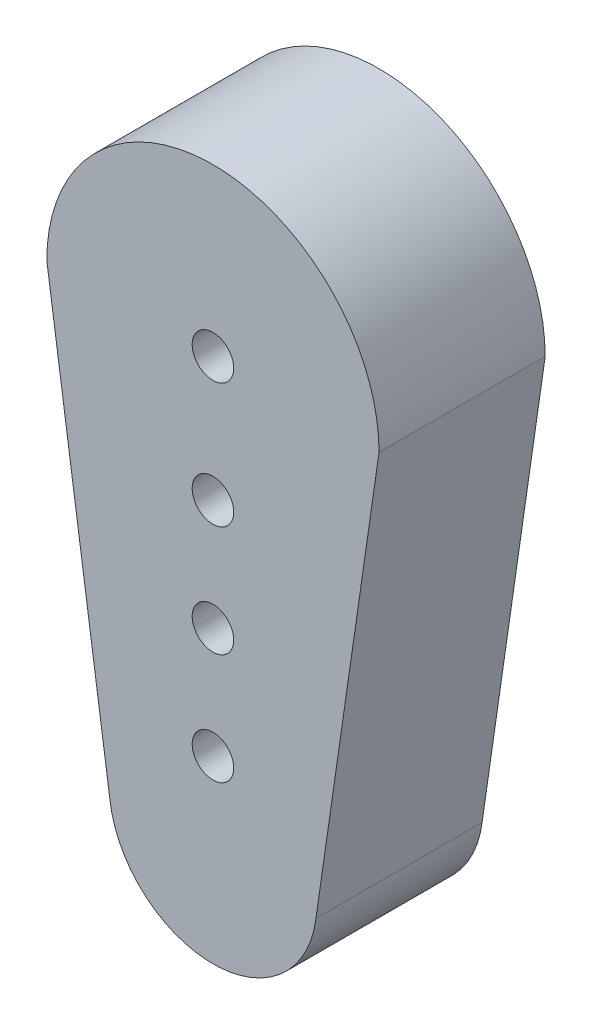
ISO-10303-21;
HEADER;
FILE_DESCRIPTION(('STEP AP214'),'2;1');
FILE_NAME('part.step','',(''),(''),'','','');
FILE_SCHEMA(('AUTOMOTIVE_DESIGN { 1 0 10303 214 1 1 1 1 }'));
ENDSEC;
DATA;
#1=APPLICATION_CONTEXT('core data for automotive mechanical design processes');
#2=APPLICATION_PROTOCOL_DEFINITION('international standard','automotive_design',2000,#1);
#3=PRODUCT_CONTEXT('',#1,'mechanical');
#4=PRODUCT('Part','Part','',(#3));
#5=PRODUCT_RELATED_PRODUCT_CATEGORY('part','',(#4));
#6=PRODUCT_DEFINITION_FORMATION('','',#4);
#7=PRODUCT_DEFINITION_CONTEXT('part definition',#1,'design');
#8=PRODUCT_DEFINITION('design','',#6,#7);
#9=PRODUCT_DEFINITION_SHAPE('','',#8);
#10=(LENGTH_UNIT() NAMED_UNIT(*) SI_UNIT(.MILLI.,.METRE.));
#11=(NAMED_UNIT(*) PLANE_ANGLE_UNIT() SI_UNIT($,.RADIAN.));
#12=(NAMED_UNIT(*) SI_UNIT($,.STERADIAN.) SOLID_ANGLE_UNIT());
#13=UNCERTAINTY_MEASURE_WITH_UNIT(LENGTH_MEASURE(1.E-05),#10,'distance_accuracy_value','');
#14=(GEOMETRIC_REPRESENTATION_CONTEXT(3) GLOBAL_UNCERTAINTY_ASSIGNED_CONTEXT((#13)) GLOBAL_UNIT_ASSIGNED_CONTEXT((#10,
#11,#12)) REPRESENTATION_CONTEXT('',''));
#15=CARTESIAN_POINT('',(0.,0.,0.));
#16=DIRECTION('',(0.,0.,1.));
#17=DIRECTION('',(1.,0.,0.));
#18=AXIS2_PLACEMENT_3D('',#15,#16,#17);
#19=CARTESIAN_POINT('',(-1.19664990586423E-09,-12.6420487647722,6.05130844555376));
#20=DIRECTION('',(0.,0.,-1.));
#21=DIRECTION('',(-1.,0.,0.));
#22=AXIS2_PLACEMENT_3D('',#19,#20,#21);
#23=CYLINDRICAL_SURFACE('',#22,0.765);
#24=CARTESIAN_POINT('',(-1.19664990586423E-09,-12.6420487647722,6.05130844555376));
#25=DIRECTION('',(0.,0.,-1.));
#26=DIRECTION('',(-1.,0.,0.));
#27=AXIS2_PLACEMENT_3D('',#24,#25,#26);
#28=CIRCLE('',#27,0.765);
#29=CARTESIAN_POINT('',(-0.76500000119665,-12.6420487647722,6.05130844555376));
#30=VERTEX_POINT('',#29);
#31=EDGE_CURVE('E43',#30,#30,#28,.T.);
#32=ORIENTED_EDGE('',*,*,#31,.F.);
#33=EDGE_LOOP('',(#32));
#34=FACE_BOUND('',#33,.T.);
#35=CARTESIAN_POINT('',(-1.19664990586423E-09,-12.6420487647722,4.72530844555376));
#36=DIRECTION('',(0.,0.,1.));
#37=DIRECTION('',(1.,0.,0.));
#38=AXIS2_PLACEMENT_3D('',#35,#36,#37);
#39=CIRCLE('',#38,0.765);
#40=CARTESIAN_POINT('',(0.76499999880335,-12.6420487647722,4.72530844555376));
#41=VERTEX_POINT('',#40);
#42=EDGE_CURVE('E11',#41,#41,#39,.T.);
#43=ORIENTED_EDGE('',*,*,#42,.F.);
#44=EDGE_LOOP('',(#43));
#45=FACE_BOUND('',#44,.T.);
#46=ADVANCED_FACE('F36',(#34,#45),#23,.F.);
#47=CARTESIAN_POINT('',(-1.19664990586423E-09,0.107951235227818,-0.0686915544462373));
#48=DIRECTION('',(0.,0.,1.));
#49=DIRECTION('',(1.,0.,0.));
#50=AXIS2_PLACEMENT_3D('',#47,#48,#49);
#51=PLANE('',#50);
#52=CARTESIAN_POINT('',(-1.19664990586423E-09,0.107951235227818,-0.0686915544462373));
#53=DIRECTION('',(0.,0.,1.));
#54=DIRECTION('',(1.,0.,0.));
#55=AXIS2_PLACEMENT_3D('',#52,#53,#54);
#56=CIRCLE('',#55,6.12);
#57=CARTESIAN_POINT('',(6.11999999880335,0.107951235227818,-0.0686915544462373));
#58=VERTEX_POINT('',#57);
#59=CARTESIAN_POINT('',(-6.12000000119665,0.107951235227818,-0.0686915544462373));
#60=VERTEX_POINT('',#59);
#61=EDGE_CURVE('E131',#58,#60,#56,.T.);
#62=ORIENTED_EDGE('',*,*,#61,.F.);
#63=DIRECTION('',(0.143511087190295,0.989648709317331,0.));
#64=VECTOR('',#63,1.);
#65=CARTESIAN_POINT('',(6.11999999880335,0.107951235227818,-0.0686915544462373));
#66=LINE('',#65,#64);
#67=CARTESIAN_POINT('',(3.79498273594539,-15.9253070891053,-0.0686915544462373));
#68=VERTEX_POINT('',#67);
#69=EDGE_CURVE('E80',#68,#58,#66,.T.);
#70=ORIENTED_EDGE('',*,*,#69,.F.);
#71=CARTESIAN_POINT('',(-1.19664990586423E-09,-15.4470487647722,-0.0686915544462373));
#72=DIRECTION('',(0.,0.,1.));
#73=DIRECTION('',(1.,0.,0.));
#74=AXIS2_PLACEMENT_3D('',#71,#72,#73);
#75=CIRCLE('',#74,3.825);
#76=CARTESIAN_POINT('',(-3.79498426071311,-15.9252950088999,-0.0686915544462373));
#77=VERTEX_POINT('',#76);
#78=EDGE_CURVE('E149',#77,#68,#75,.T.);
#79=ORIENTED_EDGE('',*,*,#78,.F.);
#80=DIRECTION('',(0.143511101058466,-0.989648707306278,0.));
#81=VECTOR('',#80,1.);
#82=CARTESIAN_POINT('',(-6.12000000119665,0.107951235227818,-0.0686915544462373));
#83=LINE('',#82,#81);
#84=EDGE_CURVE('E135',#60,#77,#83,.T.);
#85=ORIENTED_EDGE('',*,*,#84,.F.);
#86=EDGE_LOOP('',(#62,#70,#79,#85));
#87=FACE_BOUND('',#86,.T.);
#88=CARTESIAN_POINT('',(-1.19664990586423E-09,0.107951235227818,-0.0686915544462373));
#89=DIRECTION('',(0.,0.,1.));
#90=DIRECTION('',(1.,0.,0.));
#91=AXIS2_PLACEMENT_3D('',#88,#89,#90);
#92=CIRCLE('',#91,3.825);
#93=CARTESIAN_POINT('',(3.82499999880335,0.107951235227818,-0.0686915544462373));
#94=VERTEX_POINT('',#93);
#95=CARTESIAN_POINT('',(-3.82500000119665,0.107951235227818,-0.0686915544462373));
#96=VERTEX_POINT('',#95);
#97=EDGE_CURVE('E50',#94,#96,#92,.T.);
#98=ORIENTED_EDGE('',*,*,#97,.T.);
#99=DIRECTION('',(0.0995037190209989,-0.995037190209989,0.));
#100=VECTOR('',#99,1.);
#101=CARTESIAN_POINT('',(-3.82500000119665,0.107951235227818,-0.0686915544462373));
#102=LINE('',#101,#100);
#103=CARTESIAN_POINT('',(-2.29500000119665,-15.1920487647722,-0.0686915544462373));
#104=VERTEX_POINT('',#103);
#105=EDGE_CURVE('E130',#96,#104,#102,.T.);
#106=ORIENTED_EDGE('',*,*,#105,.T.);
#107=CARTESIAN_POINT('',(-1.19664990586423E-09,-15.1920487647722,-0.0686915544462373));
#108=DIRECTION('',(0.,0.,1.));
#109=DIRECTION('',(1.,0.,0.));
#110=AXIS2_PLACEMENT_3D('',#107,#108,#109);
#111=CIRCLE('',#110,2.295);
#112=CARTESIAN_POINT('',(2.29499999880335,-15.1920487647722,-0.0686915544462373));
#113=VERTEX_POINT('',#112);
#114=EDGE_CURVE('E233',#104,#113,#111,.T.);
#115=ORIENTED_EDGE('',*,*,#114,.T.);
#116=DIRECTION('',(0.0995037190209989,0.995037190209989,0.));
#117=VECTOR('',#116,1.);
#118=CARTESIAN_POINT('',(2.29499999880335,-15.1920487647722,-0.0686915544462373));
#119=LINE('',#118,#117);
#120=EDGE_CURVE('E126',#113,#94,#119,.T.);
#121=ORIENTED_EDGE('',*,*,#120,.T.);
#122=EDGE_LOOP('',(#98,#106,#115,#121));
#123=FACE_BOUND('',#122,.T.);
#124=ADVANCED_FACE('F174',(#87,#123),#51,.F.);
#125=CARTESIAN_POINT('',(-1.19664990586423E-09,0.107951235227818,6.05130844555376));
#126=DIRECTION('',(0.,0.,-1.));
#127=DIRECTION('',(-1.,0.,0.));
#128=AXIS2_PLACEMENT_3D('',#125,#126,#127);
#129=CYLINDRICAL_SURFACE('',#128,6.12);
#130=ORIENTED_EDGE('',*,*,#61,.T.);
#131=DIRECTION('',(0.,0.,-1.));
#132=VECTOR('',#131,1.);
#133=CARTESIAN_POINT('',(-6.12000000119665,0.107951235227818,6.05130844555376));
#134=LINE('',#133,#132);
#135=CARTESIAN_POINT('',(-6.12000000119665,0.107951235227818,6.05130844555376));
#136=VERTEX_POINT('',#135);
#137=EDGE_CURVE('E158',#136,#60,#134,.T.);
#138=ORIENTED_EDGE('',*,*,#137,.F.);
#139=CARTESIAN_POINT('',(-1.19664990586423E-09,0.107951235227818,6.05130844555376));
#140=DIRECTION('',(0.,0.,1.));
#141=DIRECTION('',(1.,0.,0.));
#142=AXIS2_PLACEMENT_3D('',#139,#140,#141);
#143=CIRCLE('',#142,6.12);
#144=CARTESIAN_POINT('',(6.11999999880335,0.107951235227818,6.05130844555376));
#145=VERTEX_POINT('',#144);
#146=EDGE_CURVE('E141',#145,#136,#143,.T.);
#147=ORIENTED_EDGE('',*,*,#146,.F.);
#148=DIRECTION('',(0.,0.,-1.));
#149=VECTOR('',#148,1.);
#150=CARTESIAN_POINT('',(6.11999999880335,0.107951235227818,6.05130844555376));
#151=LINE('',#150,#149);
#152=EDGE_CURVE('E146',#145,#58,#151,.T.);
#153=ORIENTED_EDGE('',*,*,#152,.T.);
#154=EDGE_LOOP('',(#130,#138,#147,#153));
#155=FACE_BOUND('',#154,.T.);
#156=ADVANCED_FACE('F208',(#155),#129,.T.);
#157=CARTESIAN_POINT('',(-6.12000000119665,0.107951235227818,6.05130844555376));
#158=DIRECTION('',(0.989648707306278,0.143511101058466,0.));
#159=DIRECTION('',(-0.143511101058466,0.989648707306278,0.));
#160=AXIS2_PLACEMENT_3D('',#157,#158,#159);
#161=PLANE('',#160);
#162=ORIENTED_EDGE('',*,*,#84,.T.);
#163=DIRECTION('',(0.,0.,-1.));
#164=VECTOR('',#163,1.);
#165=CARTESIAN_POINT('',(-3.79498426071311,-15.9252950088999,6.05130844555376));
#166=LINE('',#165,#164);
#167=CARTESIAN_POINT('',(-3.79498426071311,-15.9252950088999,6.05130844555376));
#168=VERTEX_POINT('',#167);
#169=EDGE_CURVE('E155',#168,#77,#166,.T.);
#170=ORIENTED_EDGE('',*,*,#169,.F.);
#171=DIRECTION('',(0.143511101058466,-0.989648707306278,0.));
#172=VECTOR('',#171,1.);
#173=CARTESIAN_POINT('',(-6.12000000119665,0.107951235227818,6.05130844555376));
#174=LINE('',#173,#172);
#175=EDGE_CURVE('E88',#136,#168,#174,.T.);
#176=ORIENTED_EDGE('',*,*,#175,.F.);
#177=ORIENTED_EDGE('',*,*,#137,.T.);
#178=EDGE_LOOP('',(#162,#170,#176,#177));
#179=FACE_BOUND('',#178,.T.);
#180=ADVANCED_FACE('F215',(#179),#161,.F.);
#181=CARTESIAN_POINT('',(-1.19664990586423E-09,-15.4470487647722,6.05130844555376));
#182=DIRECTION('',(0.,0.,-1.));
#183=DIRECTION('',(-1.,0.,0.));
#184=AXIS2_PLACEMENT_3D('',#181,#182,#183);
#185=CYLINDRICAL_SURFACE('',#184,3.825);
#186=ORIENTED_EDGE('',*,*,#78,.T.);
#187=DIRECTION('',(0.,0.,-1.));
#188=VECTOR('',#187,1.);
#189=CARTESIAN_POINT('',(3.79498273594539,-15.9253070891053,6.05130844555376));
#190=LINE('',#189,#188);
#191=CARTESIAN_POINT('',(3.79498273594539,-15.9253070891053,6.05130844555376));
#192=VERTEX_POINT('',#191);
#193=EDGE_CURVE('E153',#192,#68,#190,.T.);
#194=ORIENTED_EDGE('',*,*,#193,.F.);
#195=CARTESIAN_POINT('',(-1.19664990586423E-09,-15.4470487647722,6.05130844555376));
#196=DIRECTION('',(0.,0.,1.));
#197=DIRECTION('',(1.,0.,0.));
#198=AXIS2_PLACEMENT_3D('',#195,#196,#197);
#199=CIRCLE('',#198,3.825);
#200=EDGE_CURVE('E144',#168,#192,#199,.T.);
#201=ORIENTED_EDGE('',*,*,#200,.F.);
#202=ORIENTED_EDGE('',*,*,#169,.T.);
#203=EDGE_LOOP('',(#186,#194,#201,#202));
#204=FACE_BOUND('',#203,.T.);
#205=ADVANCED_FACE('F212',(#204),#185,.T.);
#206=CARTESIAN_POINT('',(6.11999999880335,0.107951235227818,6.05130844555376));
#207=DIRECTION('',(-0.989648709317331,0.143511087190295,0.));
#208=DIRECTION('',(-0.143511087190295,-0.989648709317331,0.));
#209=AXIS2_PLACEMENT_3D('',#206,#207,#208);
#210=PLANE('',#209);
#211=ORIENTED_EDGE('',*,*,#69,.T.);
#212=ORIENTED_EDGE('',*,*,#152,.F.);
#213=DIRECTION('',(0.143511087190295,0.989648709317331,0.));
#214=VECTOR('',#213,1.);
#215=CARTESIAN_POINT('',(6.11999999880335,0.107951235227818,6.05130844555376));
#216=LINE('',#215,#214);
#217=EDGE_CURVE('E59',#192,#145,#216,.T.);
#218=ORIENTED_EDGE('',*,*,#217,.F.);
#219=ORIENTED_EDGE('',*,*,#193,.T.);
#220=EDGE_LOOP('',(#211,#212,#218,#219));
#221=FACE_BOUND('',#220,.T.);
#222=ADVANCED_FACE('F204',(#221),#210,.F.);
#223=CARTESIAN_POINT('',(-1.19664990586423E-09,0.107951235227818,6.05130844555376));
#224=DIRECTION('',(0.,0.,1.));
#225=DIRECTION('',(1.,0.,0.));
#226=AXIS2_PLACEMENT_3D('',#223,#224,#225);
#227=PLANE('',#226);
#228=CARTESIAN_POINT('',(-1.19664990586423E-09,-8.56204876477218,6.05130844555376));
#229=DIRECTION('',(0.,0.,-1.));
#230=DIRECTION('',(-1.,0.,0.));
#231=AXIS2_PLACEMENT_3D('',#228,#229,#230);
#232=CIRCLE('',#231,0.765);
#233=CARTESIAN_POINT('',(-0.76500000119665,-8.56204876477218,6.05130844555376));
#234=VERTEX_POINT('',#233);
#235=EDGE_CURVE('E250',#234,#234,#232,.T.);
#236=ORIENTED_EDGE('',*,*,#235,.T.);
#237=EDGE_LOOP('',(#236));
#238=FACE_BOUND('',#237,.T.);
#239=CARTESIAN_POINT('',(-1.19664990586423E-09,-4.48204876477218,6.05130844555376));
#240=DIRECTION('',(0.,0.,-1.));
#241=DIRECTION('',(-1.,0.,0.));
#242=AXIS2_PLACEMENT_3D('',#239,#240,#241);
#243=CIRCLE('',#242,0.765);
#244=CARTESIAN_POINT('',(-0.76500000119665,-4.48204876477218,6.05130844555376));
#245=VERTEX_POINT('',#244);
#246=EDGE_CURVE('E166',#245,#245,#243,.T.);
#247=ORIENTED_EDGE('',*,*,#246,.T.);
#248=EDGE_LOOP('',(#247));
#249=FACE_BOUND('',#248,.T.);
#250=CARTESIAN_POINT('',(-1.19664990586423E-09,0.107951235227818,6.05130844555376));
#251=DIRECTION('',(0.,0.,-1.));
#252=DIRECTION('',(-1.,0.,0.));
#253=AXIS2_PLACEMENT_3D('',#250,#251,#252);
#254=CIRCLE('',#253,0.765);
#255=CARTESIAN_POINT('',(-0.76500000119665,0.107951235227818,6.05130844555376));
#256=VERTEX_POINT('',#255);
#257=EDGE_CURVE('E163',#256,#256,#254,.T.);
#258=ORIENTED_EDGE('',*,*,#257,.T.);
#259=EDGE_LOOP('',(#258));
#260=FACE_BOUND('',#259,.T.);
#261=ORIENTED_EDGE('',*,*,#146,.T.);
#262=ORIENTED_EDGE('',*,*,#175,.T.);
#263=ORIENTED_EDGE('',*,*,#200,.T.);
#264=ORIENTED_EDGE('',*,*,#217,.T.);
#265=EDGE_LOOP('',(#261,#262,#263,#264));
#266=FACE_BOUND('',#265,.T.);
#267=ORIENTED_EDGE('',*,*,#31,.T.);
#268=EDGE_LOOP('',(#267));
#269=FACE_BOUND('',#268,.T.);
#270=ADVANCED_FACE('F170',(#238,#249,#260,#266,#269),#227,.T.);
#271=CARTESIAN_POINT('',(-1.19664990586423E-09,0.107951235227818,4.72530844555376));
#272=DIRECTION('',(0.,0.,-1.));
#273=DIRECTION('',(-1.,0.,0.));
#274=AXIS2_PLACEMENT_3D('',#271,#272,#273);
#275=CYLINDRICAL_SURFACE('',#274,3.825);
#276=ORIENTED_EDGE('',*,*,#97,.F.);
#277=DIRECTION('',(0.,0.,-1.));
#278=VECTOR('',#277,1.);
#279=CARTESIAN_POINT('',(3.82499999880335,0.107951235227818,4.72530844555376));
#280=LINE('',#279,#278);
#281=CARTESIAN_POINT('',(3.82499999880335,0.107951235227818,4.72530844555376));
#282=VERTEX_POINT('',#281);
#283=EDGE_CURVE('E125',#282,#94,#280,.T.);
#284=ORIENTED_EDGE('',*,*,#283,.F.);
#285=CARTESIAN_POINT('',(-1.19664990586423E-09,0.107951235227818,4.72530844555376));
#286=DIRECTION('',(0.,0.,1.));
#287=DIRECTION('',(1.,0.,0.));
#288=AXIS2_PLACEMENT_3D('',#285,#286,#287);
#289=CIRCLE('',#288,3.825);
#290=CARTESIAN_POINT('',(-3.82500000119665,0.107951235227818,4.72530844555376));
#291=VERTEX_POINT('',#290);
#292=EDGE_CURVE('E117',#282,#291,#289,.T.);
#293=ORIENTED_EDGE('',*,*,#292,.T.);
#294=DIRECTION('',(0.,0.,-1.));
#295=VECTOR('',#294,1.);
#296=CARTESIAN_POINT('',(-3.82500000119665,0.107951235227818,4.72530844555376));
#297=LINE('',#296,#295);
#298=EDGE_CURVE('E124',#291,#96,#297,.T.);
#299=ORIENTED_EDGE('',*,*,#298,.T.);
#300=EDGE_LOOP('',(#276,#284,#293,#299));
#301=FACE_BOUND('',#300,.T.);
#302=ADVANCED_FACE('F123',(#301),#275,.F.);
#303=CARTESIAN_POINT('',(-3.82500000119665,0.107951235227818,4.72530844555376));
#304=DIRECTION('',(0.995037190209989,0.0995037190209989,0.));
#305=DIRECTION('',(-0.0995037190209989,0.995037190209989,0.));
#306=AXIS2_PLACEMENT_3D('',#303,#304,#305);
#307=PLANE('',#306);
#308=ORIENTED_EDGE('',*,*,#105,.F.);
#309=ORIENTED_EDGE('',*,*,#298,.F.);
#310=DIRECTION('',(0.0995037190209989,-0.995037190209989,0.));
#311=VECTOR('',#310,1.);
#312=CARTESIAN_POINT('',(-3.82500000119665,0.107951235227818,4.72530844555376));
#313=LINE('',#312,#311);
#314=CARTESIAN_POINT('',(-2.29500000119665,-15.1920487647722,4.72530844555376));
#315=VERTEX_POINT('',#314);
#316=EDGE_CURVE('E112',#291,#315,#313,.T.);
#317=ORIENTED_EDGE('',*,*,#316,.T.);
#318=DIRECTION('',(0.,0.,-1.));
#319=VECTOR('',#318,1.);
#320=CARTESIAN_POINT('',(-2.29500000119665,-15.1920487647722,4.72530844555376));
#321=LINE('',#320,#319);
#322=EDGE_CURVE('E132',#315,#104,#321,.T.);
#323=ORIENTED_EDGE('',*,*,#322,.T.);
#324=EDGE_LOOP('',(#308,#309,#317,#323));
#325=FACE_BOUND('',#324,.T.);
#326=ADVANCED_FACE('F128',(#325),#307,.T.);
#327=CARTESIAN_POINT('',(-1.19664990586423E-09,-15.1920487647722,4.72530844555376));
#328=DIRECTION('',(0.,0.,-1.));
#329=DIRECTION('',(-1.,0.,0.));
#330=AXIS2_PLACEMENT_3D('',#327,#328,#329);
#331=CYLINDRICAL_SURFACE('',#330,2.295);
#332=ORIENTED_EDGE('',*,*,#114,.F.);
#333=ORIENTED_EDGE('',*,*,#322,.F.);
#334=CARTESIAN_POINT('',(-1.19664990586423E-09,-15.1920487647722,4.72530844555376));
#335=DIRECTION('',(0.,0.,1.));
#336=DIRECTION('',(1.,0.,0.));
#337=AXIS2_PLACEMENT_3D('',#334,#335,#336);
#338=CIRCLE('',#337,2.295);
#339=CARTESIAN_POINT('',(2.29499999880335,-15.1920487647722,4.72530844555376));
#340=VERTEX_POINT('',#339);
#341=EDGE_CURVE('E118',#315,#340,#338,.T.);
#342=ORIENTED_EDGE('',*,*,#341,.T.);
#343=DIRECTION('',(0.,0.,-1.));
#344=VECTOR('',#343,1.);
#345=CARTESIAN_POINT('',(2.29499999880335,-15.1920487647722,4.72530844555376));
#346=LINE('',#345,#344);
#347=EDGE_CURVE('E137',#340,#113,#346,.T.);
#348=ORIENTED_EDGE('',*,*,#347,.T.);
#349=EDGE_LOOP('',(#332,#333,#342,#348));
#350=FACE_BOUND('',#349,.T.);
#351=ADVANCED_FACE('F188',(#350),#331,.F.);
#352=CARTESIAN_POINT('',(2.29499999880335,-15.1920487647722,4.72530844555376));
#353=DIRECTION('',(-0.995037190209989,0.0995037190209989,0.));
#354=DIRECTION('',(-0.0995037190209989,-0.995037190209989,0.));
#355=AXIS2_PLACEMENT_3D('',#352,#353,#354);
#356=PLANE('',#355);
#357=ORIENTED_EDGE('',*,*,#120,.F.);
#358=ORIENTED_EDGE('',*,*,#347,.F.);
#359=DIRECTION('',(0.0995037190209989,0.995037190209989,0.));
#360=VECTOR('',#359,1.);
#361=CARTESIAN_POINT('',(2.29499999880335,-15.1920487647722,4.72530844555376));
#362=LINE('',#361,#360);
#363=EDGE_CURVE('E236',#340,#282,#362,.T.);
#364=ORIENTED_EDGE('',*,*,#363,.T.);
#365=ORIENTED_EDGE('',*,*,#283,.T.);
#366=EDGE_LOOP('',(#357,#358,#364,#365));
#367=FACE_BOUND('',#366,.T.);
#368=ADVANCED_FACE('F178',(#367),#356,.T.);
#369=CARTESIAN_POINT('',(-1.19664990586423E-09,0.107951235227818,4.72530844555376));
#370=DIRECTION('',(0.,0.,1.));
#371=DIRECTION('',(1.,0.,0.));
#372=AXIS2_PLACEMENT_3D('',#369,#370,#371);
#373=PLANE('',#372);
#374=CARTESIAN_POINT('',(-1.19664990586423E-09,-8.56204876477218,4.72530844555376));
#375=DIRECTION('',(0.,0.,1.));
#376=DIRECTION('',(1.,0.,0.));
#377=AXIS2_PLACEMENT_3D('',#374,#375,#376);
#378=CIRCLE('',#377,0.765);
#379=CARTESIAN_POINT('',(0.76499999880335,-8.56204876477218,4.72530844555376));
#380=VERTEX_POINT('',#379);
#381=EDGE_CURVE('E248',#380,#380,#378,.T.);
#382=ORIENTED_EDGE('',*,*,#381,.T.);
#383=EDGE_LOOP('',(#382));
#384=FACE_BOUND('',#383,.T.);
#385=CARTESIAN_POINT('',(-1.19664990586423E-09,-4.48204876477218,4.72530844555376));
#386=DIRECTION('',(0.,0.,1.));
#387=DIRECTION('',(1.,0.,0.));
#388=AXIS2_PLACEMENT_3D('',#385,#386,#387);
#389=CIRCLE('',#388,0.765);
#390=CARTESIAN_POINT('',(0.76499999880335,-4.48204876477218,4.72530844555376));
#391=VERTEX_POINT('',#390);
#392=EDGE_CURVE('E164',#391,#391,#389,.T.);
#393=ORIENTED_EDGE('',*,*,#392,.T.);
#394=EDGE_LOOP('',(#393));
#395=FACE_BOUND('',#394,.T.);
#396=CARTESIAN_POINT('',(-1.19664990586423E-09,0.107951235227818,4.72530844555376));
#397=DIRECTION('',(0.,0.,1.));
#398=DIRECTION('',(1.,0.,0.));
#399=AXIS2_PLACEMENT_3D('',#396,#397,#398);
#400=CIRCLE('',#399,0.765);
#401=CARTESIAN_POINT('',(0.76499999880335,0.107951235227818,4.72530844555376));
#402=VERTEX_POINT('',#401);
#403=EDGE_CURVE('E160',#402,#402,#400,.T.);
#404=ORIENTED_EDGE('',*,*,#403,.T.);
#405=EDGE_LOOP('',(#404));
#406=FACE_BOUND('',#405,.T.);
#407=ORIENTED_EDGE('',*,*,#292,.F.);
#408=ORIENTED_EDGE('',*,*,#363,.F.);
#409=ORIENTED_EDGE('',*,*,#341,.F.);
#410=ORIENTED_EDGE('',*,*,#316,.F.);
#411=EDGE_LOOP('',(#407,#408,#409,#410));
#412=FACE_BOUND('',#411,.T.);
#413=ORIENTED_EDGE('',*,*,#42,.T.);
#414=EDGE_LOOP('',(#413));
#415=FACE_BOUND('',#414,.T.);
#416=ADVANCED_FACE('F114',(#384,#395,#406,#412,#415),#373,.F.);
#417=CARTESIAN_POINT('',(-1.19664990586423E-09,0.107951235227818,6.05130844555376));
#418=DIRECTION('',(0.,0.,-1.));
#419=DIRECTION('',(-1.,0.,0.));
#420=AXIS2_PLACEMENT_3D('',#417,#418,#419);
#421=CYLINDRICAL_SURFACE('',#420,0.765);
#422=ORIENTED_EDGE('',*,*,#257,.F.);
#423=EDGE_LOOP('',(#422));
#424=FACE_BOUND('',#423,.T.);
#425=ORIENTED_EDGE('',*,*,#403,.F.);
#426=EDGE_LOOP('',(#425));
#427=FACE_BOUND('',#426,.T.);
#428=ADVANCED_FACE('F177',(#424,#427),#421,.F.);
#429=CARTESIAN_POINT('',(-1.19664990586423E-09,-4.48204876477218,6.05130844555376));
#430=DIRECTION('',(0.,0.,-1.));
#431=DIRECTION('',(-1.,0.,0.));
#432=AXIS2_PLACEMENT_3D('',#429,#430,#431);
#433=CYLINDRICAL_SURFACE('',#432,0.765);
#434=ORIENTED_EDGE('',*,*,#246,.F.);
#435=EDGE_LOOP('',(#434));
#436=FACE_BOUND('',#435,.T.);
#437=ORIENTED_EDGE('',*,*,#392,.F.);
#438=EDGE_LOOP('',(#437));
#439=FACE_BOUND('',#438,.T.);
#440=ADVANCED_FACE('F185',(#436,#439),#433,.F.);
#441=CARTESIAN_POINT('',(-1.19664990586423E-09,-8.56204876477218,6.05130844555376));
#442=DIRECTION('',(0.,0.,-1.));
#443=DIRECTION('',(-1.,0.,0.));
#444=AXIS2_PLACEMENT_3D('',#441,#442,#443);
#445=CYLINDRICAL_SURFACE('',#444,0.765);
#446=ORIENTED_EDGE('',*,*,#235,.F.);
#447=EDGE_LOOP('',(#446));
#448=FACE_BOUND('',#447,.T.);
#449=ORIENTED_EDGE('',*,*,#381,.F.);
#450=EDGE_LOOP('',(#449));
#451=FACE_BOUND('',#450,.T.);
#452=ADVANCED_FACE('F255',(#448,#451),#445,.F.);
#453=CLOSED_SHELL('',(#46,#124,#156,#180,#205,#222,#270,#302,#326,#351,#368,#416,#428,#440,#452));
#454=MANIFOLD_SOLID_BREP('B2',#453);
#455=ADVANCED_BREP_SHAPE_REPRESENTATION('',(#18,#454),#14);
#456=SHAPE_DEFINITION_REPRESENTATION(#9,#455);
ENDSEC;
END-ISO-10303-21;
